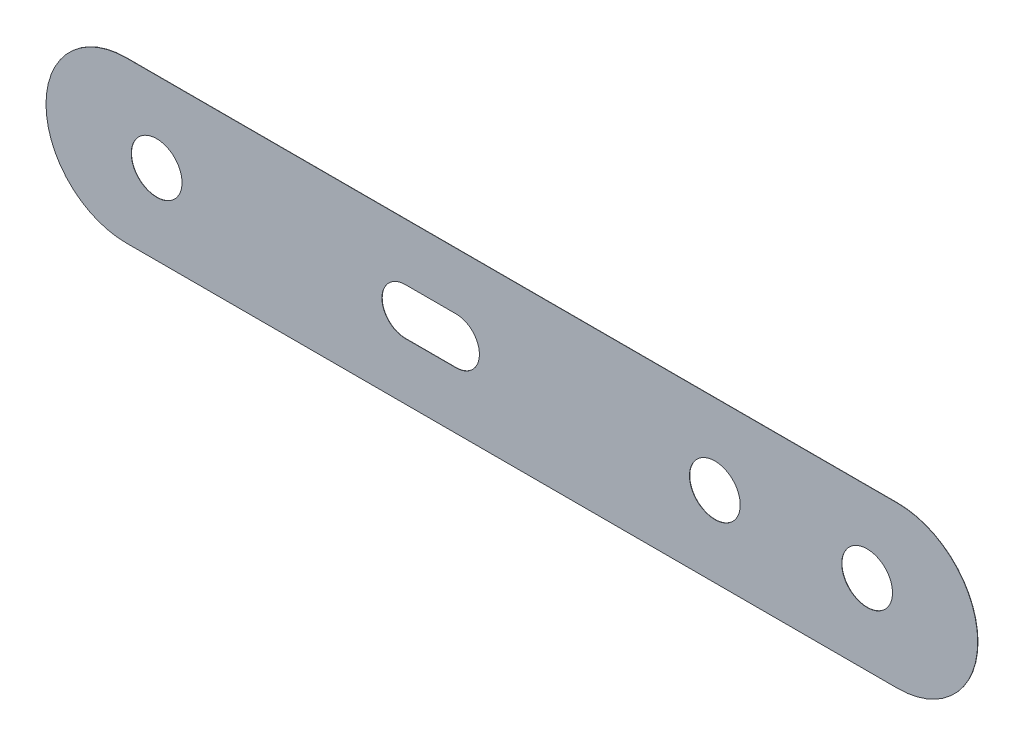
ISO-10303-21;
HEADER;
FILE_DESCRIPTION(('STEP AP214'),'2;1');
FILE_NAME('part.step','',(''),(''),'','','');
FILE_SCHEMA(('AUTOMOTIVE_DESIGN { 1 0 10303 214 1 1 1 1 }'));
ENDSEC;
DATA;
#1=APPLICATION_CONTEXT('core data for automotive mechanical design processes');
#2=APPLICATION_PROTOCOL_DEFINITION('international standard','automotive_design',2000,#1);
#3=PRODUCT_CONTEXT('',#1,'mechanical');
#4=PRODUCT('Part','Part','',(#3));
#5=PRODUCT_RELATED_PRODUCT_CATEGORY('part','',(#4));
#6=PRODUCT_DEFINITION_FORMATION('','',#4);
#7=PRODUCT_DEFINITION_CONTEXT('part definition',#1,'design');
#8=PRODUCT_DEFINITION('design','',#6,#7);
#9=PRODUCT_DEFINITION_SHAPE('','',#8);
#10=(LENGTH_UNIT() NAMED_UNIT(*) SI_UNIT(.MILLI.,.METRE.));
#11=(NAMED_UNIT(*) PLANE_ANGLE_UNIT() SI_UNIT($,.RADIAN.));
#12=(NAMED_UNIT(*) SI_UNIT($,.STERADIAN.) SOLID_ANGLE_UNIT());
#13=UNCERTAINTY_MEASURE_WITH_UNIT(LENGTH_MEASURE(1.E-05),#10,'distance_accuracy_value','');
#14=(GEOMETRIC_REPRESENTATION_CONTEXT(3) GLOBAL_UNCERTAINTY_ASSIGNED_CONTEXT((#13)) GLOBAL_UNIT_ASSIGNED_CONTEXT((#10,
#11,#12)) REPRESENTATION_CONTEXT('',''));
#15=CARTESIAN_POINT('',(0.,0.,0.));
#16=DIRECTION('',(0.,0.,1.));
#17=DIRECTION('',(1.,0.,0.));
#18=AXIS2_PLACEMENT_3D('',#15,#16,#17);
#19=CARTESIAN_POINT('',(-10.5,0.,-0.65));
#20=DIRECTION('',(0.,0.,1.));
#21=DIRECTION('',(1.,0.,0.));
#22=AXIS2_PLACEMENT_3D('',#19,#20,#21);
#23=CYLINDRICAL_SURFACE('',#22,2.3);
#24=DIRECTION('',(0.,0.,-1.));
#25=VECTOR('',#24,1.);
#26=CARTESIAN_POINT('',(-10.5,-2.3,-0.65));
#27=LINE('',#26,#25);
#28=CARTESIAN_POINT('',(-10.5,-2.3,-0.65));
#29=VERTEX_POINT('',#28);
#30=CARTESIAN_POINT('',(-10.5,-2.3,-0.675));
#31=VERTEX_POINT('',#30);
#32=EDGE_CURVE('E11',#29,#31,#27,.T.);
#33=ORIENTED_EDGE('',*,*,#32,.T.);
#34=CARTESIAN_POINT('',(-10.5,0.,-0.675));
#35=DIRECTION('',(0.,0.,1.));
#36=DIRECTION('',(0.,1.,0.));
#37=AXIS2_PLACEMENT_3D('',#34,#35,#36);
#38=CIRCLE('',#37,2.3);
#39=CARTESIAN_POINT('',(-10.5,2.3,-0.675));
#40=VERTEX_POINT('',#39);
#41=EDGE_CURVE('E303',#40,#31,#38,.T.);
#42=ORIENTED_EDGE('',*,*,#41,.F.);
#43=DIRECTION('',(0.,0.,-1.));
#44=VECTOR('',#43,1.);
#45=CARTESIAN_POINT('',(-10.5,2.3,-0.65));
#46=LINE('',#45,#44);
#47=CARTESIAN_POINT('',(-10.5,2.3,-0.65));
#48=VERTEX_POINT('',#47);
#49=EDGE_CURVE('E202',#48,#40,#46,.T.);
#50=ORIENTED_EDGE('',*,*,#49,.F.);
#51=CARTESIAN_POINT('',(-10.5,0.,-0.65));
#52=DIRECTION('',(0.,0.,1.));
#53=DIRECTION('',(0.,1.,0.));
#54=AXIS2_PLACEMENT_3D('',#51,#52,#53);
#55=CIRCLE('',#54,2.3);
#56=EDGE_CURVE('E184',#48,#29,#55,.T.);
#57=ORIENTED_EDGE('',*,*,#56,.T.);
#58=EDGE_LOOP('',(#33,#42,#50,#57));
#59=FACE_BOUND('',#58,.T.);
#60=ADVANCED_FACE('F16',(#59),#23,.F.);
#61=CARTESIAN_POINT('',(-10.5,-2.3,-0.65));
#62=DIRECTION('',(0.,-1.,0.));
#63=DIRECTION('',(0.,0.,-1.));
#64=AXIS2_PLACEMENT_3D('',#61,#62,#63);
#65=PLANE('',#64);
#66=DIRECTION('',(0.,0.,-1.));
#67=VECTOR('',#66,1.);
#68=CARTESIAN_POINT('',(-5.5,-2.3,-0.65));
#69=LINE('',#68,#67);
#70=CARTESIAN_POINT('',(-5.5,-2.3,-0.65));
#71=VERTEX_POINT('',#70);
#72=CARTESIAN_POINT('',(-5.5,-2.3,-0.675));
#73=VERTEX_POINT('',#72);
#74=EDGE_CURVE('E27',#71,#73,#69,.T.);
#75=ORIENTED_EDGE('',*,*,#74,.T.);
#76=DIRECTION('',(1.,0.,0.));
#77=VECTOR('',#76,1.);
#78=CARTESIAN_POINT('',(-10.5,-2.3,-0.675));
#79=LINE('',#78,#77);
#80=EDGE_CURVE('E300',#31,#73,#79,.T.);
#81=ORIENTED_EDGE('',*,*,#80,.F.);
#82=ORIENTED_EDGE('',*,*,#32,.F.);
#83=DIRECTION('',(1.,0.,0.));
#84=VECTOR('',#83,1.);
#85=CARTESIAN_POINT('',(-10.5,-2.3,-0.65));
#86=LINE('',#85,#84);
#87=EDGE_CURVE('E159',#29,#71,#86,.T.);
#88=ORIENTED_EDGE('',*,*,#87,.T.);
#89=EDGE_LOOP('',(#75,#81,#82,#88));
#90=FACE_BOUND('',#89,.T.);
#91=ADVANCED_FACE('F242',(#90),#65,.F.);
#92=CARTESIAN_POINT('',(-5.5,0.,-0.65));
#93=DIRECTION('',(0.,0.,1.));
#94=DIRECTION('',(1.,0.,0.));
#95=AXIS2_PLACEMENT_3D('',#92,#93,#94);
#96=CYLINDRICAL_SURFACE('',#95,2.3);
#97=DIRECTION('',(0.,0.,-1.));
#98=VECTOR('',#97,1.);
#99=CARTESIAN_POINT('',(-5.5,2.3,-0.65));
#100=LINE('',#99,#98);
#101=CARTESIAN_POINT('',(-5.5,2.3,-0.65));
#102=VERTEX_POINT('',#101);
#103=CARTESIAN_POINT('',(-5.5,2.3,-0.675));
#104=VERTEX_POINT('',#103);
#105=EDGE_CURVE('E41',#102,#104,#100,.T.);
#106=ORIENTED_EDGE('',*,*,#105,.T.);
#107=CARTESIAN_POINT('',(-5.5,0.,-0.675));
#108=DIRECTION('',(0.,0.,1.));
#109=DIRECTION('',(0.,-1.,0.));
#110=AXIS2_PLACEMENT_3D('',#107,#108,#109);
#111=CIRCLE('',#110,2.3);
#112=EDGE_CURVE('E222',#73,#104,#111,.T.);
#113=ORIENTED_EDGE('',*,*,#112,.F.);
#114=ORIENTED_EDGE('',*,*,#74,.F.);
#115=CARTESIAN_POINT('',(-5.5,0.,-0.65));
#116=DIRECTION('',(0.,0.,1.));
#117=DIRECTION('',(0.,-1.,0.));
#118=AXIS2_PLACEMENT_3D('',#115,#116,#117);
#119=CIRCLE('',#118,2.3);
#120=EDGE_CURVE('E156',#71,#102,#119,.T.);
#121=ORIENTED_EDGE('',*,*,#120,.T.);
#122=EDGE_LOOP('',(#106,#113,#114,#121));
#123=FACE_BOUND('',#122,.T.);
#124=ADVANCED_FACE('F381',(#123),#96,.F.);
#125=CARTESIAN_POINT('',(-5.5,2.3,-0.65));
#126=DIRECTION('',(0.,1.,0.));
#127=DIRECTION('',(1.,0.,0.));
#128=AXIS2_PLACEMENT_3D('',#125,#126,#127);
#129=PLANE('',#128);
#130=ORIENTED_EDGE('',*,*,#49,.T.);
#131=DIRECTION('',(-1.,0.,0.));
#132=VECTOR('',#131,1.);
#133=CARTESIAN_POINT('',(-5.5,2.3,-0.675));
#134=LINE('',#133,#132);
#135=EDGE_CURVE('E198',#104,#40,#134,.T.);
#136=ORIENTED_EDGE('',*,*,#135,.F.);
#137=ORIENTED_EDGE('',*,*,#105,.F.);
#138=DIRECTION('',(-1.,0.,0.));
#139=VECTOR('',#138,1.);
#140=CARTESIAN_POINT('',(-5.5,2.3,-0.65));
#141=LINE('',#140,#139);
#142=EDGE_CURVE('E210',#102,#48,#141,.T.);
#143=ORIENTED_EDGE('',*,*,#142,.T.);
#144=EDGE_LOOP('',(#130,#136,#137,#143));
#145=FACE_BOUND('',#144,.T.);
#146=ADVANCED_FACE('F373',(#145),#129,.F.);
#147=CARTESIAN_POINT('',(35.,0.,-0.65));
#148=DIRECTION('',(0.,0.,1.));
#149=DIRECTION('',(1.,0.,0.));
#150=AXIS2_PLACEMENT_3D('',#147,#148,#149);
#151=CYLINDRICAL_SURFACE('',#150,2.5);
#152=DIRECTION('',(0.,0.,1.));
#153=VECTOR('',#152,1.);
#154=CARTESIAN_POINT('',(37.5,0.,-0.675));
#155=LINE('',#154,#153);
#156=CARTESIAN_POINT('',(37.5,0.,-0.675));
#157=VERTEX_POINT('',#156);
#158=CARTESIAN_POINT('',(37.5,0.,-0.65));
#159=VERTEX_POINT('',#158);
#160=EDGE_CURVE('E201',#157,#159,#155,.T.);
#161=ORIENTED_EDGE('',*,*,#160,.F.);
#162=CARTESIAN_POINT('',(35.,0.,-0.675));
#163=DIRECTION('',(0.,0.,1.));
#164=DIRECTION('',(-1.,0.,0.));
#165=AXIS2_PLACEMENT_3D('',#162,#163,#164);
#166=CIRCLE('',#165,2.5);
#167=CARTESIAN_POINT('',(32.5,0.,-0.675));
#168=VERTEX_POINT('',#167);
#169=EDGE_CURVE('E318',#168,#157,#166,.T.);
#170=ORIENTED_EDGE('',*,*,#169,.F.);
#171=DIRECTION('',(0.,0.,1.));
#172=VECTOR('',#171,1.);
#173=CARTESIAN_POINT('',(32.5,0.,-0.675));
#174=LINE('',#173,#172);
#175=CARTESIAN_POINT('',(32.5,0.,-0.65));
#176=VERTEX_POINT('',#175);
#177=EDGE_CURVE('E175',#168,#176,#174,.T.);
#178=ORIENTED_EDGE('',*,*,#177,.T.);
#179=CARTESIAN_POINT('',(35.,0.,-0.65));
#180=DIRECTION('',(0.,0.,1.));
#181=DIRECTION('',(-1.,0.,0.));
#182=AXIS2_PLACEMENT_3D('',#179,#180,#181);
#183=CIRCLE('',#182,2.5);
#184=EDGE_CURVE('E167',#176,#159,#183,.T.);
#185=ORIENTED_EDGE('',*,*,#184,.T.);
#186=EDGE_LOOP('',(#161,#170,#178,#185));
#187=FACE_BOUND('',#186,.T.);
#188=ADVANCED_FACE('F361',(#187),#151,.F.);
#189=CARTESIAN_POINT('',(35.,0.,-0.65));
#190=DIRECTION('',(0.,0.,1.));
#191=DIRECTION('',(1.,0.,0.));
#192=AXIS2_PLACEMENT_3D('',#189,#190,#191);
#193=CYLINDRICAL_SURFACE('',#192,2.5);
#194=ORIENTED_EDGE('',*,*,#177,.F.);
#195=CARTESIAN_POINT('',(35.,0.,-0.675));
#196=DIRECTION('',(0.,0.,1.));
#197=DIRECTION('',(1.,0.,0.));
#198=AXIS2_PLACEMENT_3D('',#195,#196,#197);
#199=CIRCLE('',#198,2.5);
#200=EDGE_CURVE('E307',#157,#168,#199,.T.);
#201=ORIENTED_EDGE('',*,*,#200,.F.);
#202=ORIENTED_EDGE('',*,*,#160,.T.);
#203=CARTESIAN_POINT('',(35.,0.,-0.65));
#204=DIRECTION('',(0.,0.,1.));
#205=DIRECTION('',(1.,0.,0.));
#206=AXIS2_PLACEMENT_3D('',#203,#204,#205);
#207=CIRCLE('',#206,2.5);
#208=EDGE_CURVE('E160',#159,#176,#207,.T.);
#209=ORIENTED_EDGE('',*,*,#208,.T.);
#210=EDGE_LOOP('',(#194,#201,#202,#209));
#211=FACE_BOUND('',#210,.T.);
#212=ADVANCED_FACE('F364',(#211),#193,.F.);
#213=CARTESIAN_POINT('',(20.,0.,-0.65));
#214=DIRECTION('',(0.,0.,1.));
#215=DIRECTION('',(1.,0.,0.));
#216=AXIS2_PLACEMENT_3D('',#213,#214,#215);
#217=CYLINDRICAL_SURFACE('',#216,2.5);
#218=DIRECTION('',(0.,0.,1.));
#219=VECTOR('',#218,1.);
#220=CARTESIAN_POINT('',(22.5,0.,-0.675));
#221=LINE('',#220,#219);
#222=CARTESIAN_POINT('',(22.5,0.,-0.675));
#223=VERTEX_POINT('',#222);
#224=CARTESIAN_POINT('',(22.5,0.,-0.65));
#225=VERTEX_POINT('',#224);
#226=EDGE_CURVE('E171',#223,#225,#221,.T.);
#227=ORIENTED_EDGE('',*,*,#226,.F.);
#228=CARTESIAN_POINT('',(20.,0.,-0.675));
#229=DIRECTION('',(0.,0.,1.));
#230=DIRECTION('',(-1.,0.,0.));
#231=AXIS2_PLACEMENT_3D('',#228,#229,#230);
#232=CIRCLE('',#231,2.5);
#233=CARTESIAN_POINT('',(17.5,0.,-0.675));
#234=VERTEX_POINT('',#233);
#235=EDGE_CURVE('E20',#234,#223,#232,.T.);
#236=ORIENTED_EDGE('',*,*,#235,.F.);
#237=DIRECTION('',(0.,0.,1.));
#238=VECTOR('',#237,1.);
#239=CARTESIAN_POINT('',(17.5,0.,-0.675));
#240=LINE('',#239,#238);
#241=CARTESIAN_POINT('',(17.5,0.,-0.65));
#242=VERTEX_POINT('',#241);
#243=EDGE_CURVE('E176',#234,#242,#240,.T.);
#244=ORIENTED_EDGE('',*,*,#243,.T.);
#245=CARTESIAN_POINT('',(20.,0.,-0.65));
#246=DIRECTION('',(0.,0.,1.));
#247=DIRECTION('',(-1.,0.,0.));
#248=AXIS2_PLACEMENT_3D('',#245,#246,#247);
#249=CIRCLE('',#248,2.5);
#250=EDGE_CURVE('E150',#242,#225,#249,.T.);
#251=ORIENTED_EDGE('',*,*,#250,.T.);
#252=EDGE_LOOP('',(#227,#236,#244,#251));
#253=FACE_BOUND('',#252,.T.);
#254=ADVANCED_FACE('F290',(#253),#217,.F.);
#255=CARTESIAN_POINT('',(20.,0.,-0.65));
#256=DIRECTION('',(0.,0.,1.));
#257=DIRECTION('',(1.,0.,0.));
#258=AXIS2_PLACEMENT_3D('',#255,#256,#257);
#259=CYLINDRICAL_SURFACE('',#258,2.5);
#260=ORIENTED_EDGE('',*,*,#243,.F.);
#261=CARTESIAN_POINT('',(20.,0.,-0.675));
#262=DIRECTION('',(0.,0.,1.));
#263=DIRECTION('',(1.,0.,0.));
#264=AXIS2_PLACEMENT_3D('',#261,#262,#263);
#265=CIRCLE('',#264,2.5);
#266=EDGE_CURVE('E286',#223,#234,#265,.T.);
#267=ORIENTED_EDGE('',*,*,#266,.F.);
#268=ORIENTED_EDGE('',*,*,#226,.T.);
#269=CARTESIAN_POINT('',(20.,0.,-0.65));
#270=DIRECTION('',(0.,0.,1.));
#271=DIRECTION('',(1.,0.,0.));
#272=AXIS2_PLACEMENT_3D('',#269,#270,#271);
#273=CIRCLE('',#272,2.5);
#274=EDGE_CURVE('E154',#225,#242,#273,.T.);
#275=ORIENTED_EDGE('',*,*,#274,.T.);
#276=EDGE_LOOP('',(#260,#267,#268,#275));
#277=FACE_BOUND('',#276,.T.);
#278=ADVANCED_FACE('F283',(#277),#259,.F.);
#279=CARTESIAN_POINT('',(-35.,0.,-0.65));
#280=DIRECTION('',(0.,0.,1.));
#281=DIRECTION('',(1.,0.,0.));
#282=AXIS2_PLACEMENT_3D('',#279,#280,#281);
#283=CYLINDRICAL_SURFACE('',#282,2.5);
#284=DIRECTION('',(0.,0.,1.));
#285=VECTOR('',#284,1.);
#286=CARTESIAN_POINT('',(-32.5,0.,-0.675));
#287=LINE('',#286,#285);
#288=CARTESIAN_POINT('',(-32.5,0.,-0.675));
#289=VERTEX_POINT('',#288);
#290=CARTESIAN_POINT('',(-32.5,0.,-0.65));
#291=VERTEX_POINT('',#290);
#292=EDGE_CURVE('E197',#289,#291,#287,.T.);
#293=ORIENTED_EDGE('',*,*,#292,.F.);
#294=CARTESIAN_POINT('',(-35.,0.,-0.675));
#295=DIRECTION('',(0.,0.,1.));
#296=DIRECTION('',(-1.,0.,0.));
#297=AXIS2_PLACEMENT_3D('',#294,#295,#296);
#298=CIRCLE('',#297,2.5);
#299=CARTESIAN_POINT('',(-37.5,0.,-0.675));
#300=VERTEX_POINT('',#299);
#301=EDGE_CURVE('E192',#300,#289,#298,.T.);
#302=ORIENTED_EDGE('',*,*,#301,.F.);
#303=DIRECTION('',(0.,0.,1.));
#304=VECTOR('',#303,1.);
#305=CARTESIAN_POINT('',(-37.5,0.,-0.675));
#306=LINE('',#305,#304);
#307=CARTESIAN_POINT('',(-37.5,0.,-0.65));
#308=VERTEX_POINT('',#307);
#309=EDGE_CURVE('E193',#300,#308,#306,.T.);
#310=ORIENTED_EDGE('',*,*,#309,.T.);
#311=CARTESIAN_POINT('',(-35.,0.,-0.65));
#312=DIRECTION('',(0.,0.,1.));
#313=DIRECTION('',(-1.,0.,0.));
#314=AXIS2_PLACEMENT_3D('',#311,#312,#313);
#315=CIRCLE('',#314,2.5);
#316=EDGE_CURVE('E180',#308,#291,#315,.T.);
#317=ORIENTED_EDGE('',*,*,#316,.T.);
#318=EDGE_LOOP('',(#293,#302,#310,#317));
#319=FACE_BOUND('',#318,.T.);
#320=ADVANCED_FACE('F335',(#319),#283,.F.);
#321=CARTESIAN_POINT('',(-35.,0.,-0.65));
#322=DIRECTION('',(0.,0.,1.));
#323=DIRECTION('',(1.,0.,0.));
#324=AXIS2_PLACEMENT_3D('',#321,#322,#323);
#325=CYLINDRICAL_SURFACE('',#324,2.5);
#326=ORIENTED_EDGE('',*,*,#309,.F.);
#327=CARTESIAN_POINT('',(-35.,0.,-0.675));
#328=DIRECTION('',(0.,0.,1.));
#329=DIRECTION('',(1.,0.,0.));
#330=AXIS2_PLACEMENT_3D('',#327,#328,#329);
#331=CIRCLE('',#330,2.5);
#332=EDGE_CURVE('E188',#289,#300,#331,.T.);
#333=ORIENTED_EDGE('',*,*,#332,.F.);
#334=ORIENTED_EDGE('',*,*,#292,.T.);
#335=CARTESIAN_POINT('',(-35.,0.,-0.65));
#336=DIRECTION('',(0.,0.,1.));
#337=DIRECTION('',(1.,0.,0.));
#338=AXIS2_PLACEMENT_3D('',#335,#336,#337);
#339=CIRCLE('',#338,2.5);
#340=EDGE_CURVE('E155',#291,#308,#339,.T.);
#341=ORIENTED_EDGE('',*,*,#340,.T.);
#342=EDGE_LOOP('',(#326,#333,#334,#341));
#343=FACE_BOUND('',#342,.T.);
#344=ADVANCED_FACE('F329',(#343),#325,.F.);
#345=CARTESIAN_POINT('',(0.,0.,-0.675));
#346=DIRECTION('',(0.,0.,1.));
#347=DIRECTION('',(1.,0.,0.));
#348=AXIS2_PLACEMENT_3D('',#345,#346,#347);
#349=PLANE('',#348);
#350=ORIENTED_EDGE('',*,*,#41,.T.);
#351=ORIENTED_EDGE('',*,*,#80,.T.);
#352=ORIENTED_EDGE('',*,*,#112,.T.);
#353=ORIENTED_EDGE('',*,*,#135,.T.);
#354=EDGE_LOOP('',(#350,#351,#352,#353));
#355=FACE_BOUND('',#354,.T.);
#356=ORIENTED_EDGE('',*,*,#169,.T.);
#357=ORIENTED_EDGE('',*,*,#200,.T.);
#358=EDGE_LOOP('',(#356,#357));
#359=FACE_BOUND('',#358,.T.);
#360=ORIENTED_EDGE('',*,*,#235,.T.);
#361=ORIENTED_EDGE('',*,*,#266,.T.);
#362=EDGE_LOOP('',(#360,#361));
#363=FACE_BOUND('',#362,.T.);
#364=ORIENTED_EDGE('',*,*,#301,.T.);
#365=ORIENTED_EDGE('',*,*,#332,.T.);
#366=EDGE_LOOP('',(#364,#365));
#367=FACE_BOUND('',#366,.T.);
#368=DIRECTION('',(-1.,0.,0.));
#369=VECTOR('',#368,1.);
#370=CARTESIAN_POINT('',(38.,-7.9,-0.675));
#371=LINE('',#370,#369);
#372=CARTESIAN_POINT('',(38.,-7.9,-0.675));
#373=VERTEX_POINT('',#372);
#374=CARTESIAN_POINT('',(-38.,-7.9,-0.675));
#375=VERTEX_POINT('',#374);
#376=EDGE_CURVE('E118',#373,#375,#371,.T.);
#377=ORIENTED_EDGE('',*,*,#376,.T.);
#378=CARTESIAN_POINT('',(-38.,0.,-0.675));
#379=DIRECTION('',(0.,0.,-1.));
#380=DIRECTION('',(0.,-1.,0.));
#381=AXIS2_PLACEMENT_3D('',#378,#379,#380);
#382=CIRCLE('',#381,7.9);
#383=CARTESIAN_POINT('',(-38.,7.9,-0.675));
#384=VERTEX_POINT('',#383);
#385=EDGE_CURVE('E111',#375,#384,#382,.T.);
#386=ORIENTED_EDGE('',*,*,#385,.T.);
#387=DIRECTION('',(1.,0.,0.));
#388=VECTOR('',#387,1.);
#389=CARTESIAN_POINT('',(-38.,7.9,-0.675));
#390=LINE('',#389,#388);
#391=CARTESIAN_POINT('',(38.,7.9,-0.675));
#392=VERTEX_POINT('',#391);
#393=EDGE_CURVE('E116',#384,#392,#390,.T.);
#394=ORIENTED_EDGE('',*,*,#393,.T.);
#395=CARTESIAN_POINT('',(38.,0.,-0.675));
#396=DIRECTION('',(0.,0.,-1.));
#397=DIRECTION('',(0.,1.,0.));
#398=AXIS2_PLACEMENT_3D('',#395,#396,#397);
#399=CIRCLE('',#398,7.9);
#400=EDGE_CURVE('E143',#392,#373,#399,.T.);
#401=ORIENTED_EDGE('',*,*,#400,.T.);
#402=EDGE_LOOP('',(#377,#386,#394,#401));
#403=FACE_BOUND('',#402,.T.);
#404=ADVANCED_FACE('F113',(#355,#359,#363,#367,#403),#349,.F.);
#405=CARTESIAN_POINT('',(-38.,-7.9,-0.65));
#406=DIRECTION('',(0.,-1.,0.));
#407=DIRECTION('',(0.,0.,-1.));
#408=AXIS2_PLACEMENT_3D('',#405,#406,#407);
#409=PLANE('',#408);
#410=DIRECTION('',(0.,0.,1.));
#411=VECTOR('',#410,1.);
#412=CARTESIAN_POINT('',(-38.,-7.9,-0.675));
#413=LINE('',#412,#411);
#414=CARTESIAN_POINT('',(-38.,-7.9,-0.65));
#415=VERTEX_POINT('',#414);
#416=EDGE_CURVE('E123',#375,#415,#413,.T.);
#417=ORIENTED_EDGE('',*,*,#416,.F.);
#418=ORIENTED_EDGE('',*,*,#376,.F.);
#419=DIRECTION('',(0.,0.,1.));
#420=VECTOR('',#419,1.);
#421=CARTESIAN_POINT('',(38.,-7.9,-0.675));
#422=LINE('',#421,#420);
#423=CARTESIAN_POINT('',(38.,-7.9,-0.65));
#424=VERTEX_POINT('',#423);
#425=EDGE_CURVE('E214',#373,#424,#422,.T.);
#426=ORIENTED_EDGE('',*,*,#425,.T.);
#427=DIRECTION('',(-1.,0.,0.));
#428=VECTOR('',#427,1.);
#429=CARTESIAN_POINT('',(38.,-7.9,-0.65));
#430=LINE('',#429,#428);
#431=EDGE_CURVE('E148',#424,#415,#430,.T.);
#432=ORIENTED_EDGE('',*,*,#431,.T.);
#433=EDGE_LOOP('',(#417,#418,#426,#432));
#434=FACE_BOUND('',#433,.T.);
#435=ADVANCED_FACE('F328',(#434),#409,.T.);
#436=CARTESIAN_POINT('',(-38.,0.,-0.65));
#437=DIRECTION('',(0.,0.,1.));
#438=DIRECTION('',(1.,0.,0.));
#439=AXIS2_PLACEMENT_3D('',#436,#437,#438);
#440=CYLINDRICAL_SURFACE('',#439,7.9);
#441=DIRECTION('',(0.,0.,1.));
#442=VECTOR('',#441,1.);
#443=CARTESIAN_POINT('',(-38.,7.9,-0.675));
#444=LINE('',#443,#442);
#445=CARTESIAN_POINT('',(-38.,7.9,-0.65));
#446=VERTEX_POINT('',#445);
#447=EDGE_CURVE('E124',#384,#446,#444,.T.);
#448=ORIENTED_EDGE('',*,*,#447,.F.);
#449=ORIENTED_EDGE('',*,*,#385,.F.);
#450=ORIENTED_EDGE('',*,*,#416,.T.);
#451=CARTESIAN_POINT('',(-38.,0.,-0.65));
#452=DIRECTION('',(0.,0.,-1.));
#453=DIRECTION('',(0.,-1.,0.));
#454=AXIS2_PLACEMENT_3D('',#451,#452,#453);
#455=CIRCLE('',#454,7.9);
#456=EDGE_CURVE('E130',#415,#446,#455,.T.);
#457=ORIENTED_EDGE('',*,*,#456,.T.);
#458=EDGE_LOOP('',(#448,#449,#450,#457));
#459=FACE_BOUND('',#458,.T.);
#460=ADVANCED_FACE('F128',(#459),#440,.T.);
#461=CARTESIAN_POINT('',(38.,7.9,-0.65));
#462=DIRECTION('',(0.,1.,0.));
#463=DIRECTION('',(1.,0.,0.));
#464=AXIS2_PLACEMENT_3D('',#461,#462,#463);
#465=PLANE('',#464);
#466=DIRECTION('',(0.,0.,1.));
#467=VECTOR('',#466,1.);
#468=CARTESIAN_POINT('',(38.,7.9,-0.675));
#469=LINE('',#468,#467);
#470=CARTESIAN_POINT('',(38.,7.9,-0.65));
#471=VERTEX_POINT('',#470);
#472=EDGE_CURVE('E136',#392,#471,#469,.T.);
#473=ORIENTED_EDGE('',*,*,#472,.F.);
#474=ORIENTED_EDGE('',*,*,#393,.F.);
#475=ORIENTED_EDGE('',*,*,#447,.T.);
#476=DIRECTION('',(1.,0.,0.));
#477=VECTOR('',#476,1.);
#478=CARTESIAN_POINT('',(-38.,7.9,-0.65));
#479=LINE('',#478,#477);
#480=EDGE_CURVE('E149',#446,#471,#479,.T.);
#481=ORIENTED_EDGE('',*,*,#480,.T.);
#482=EDGE_LOOP('',(#473,#474,#475,#481));
#483=FACE_BOUND('',#482,.T.);
#484=ADVANCED_FACE('F18',(#483),#465,.T.);
#485=CARTESIAN_POINT('',(38.,0.,-0.65));
#486=DIRECTION('',(0.,0.,1.));
#487=DIRECTION('',(1.,0.,0.));
#488=AXIS2_PLACEMENT_3D('',#485,#486,#487);
#489=CYLINDRICAL_SURFACE('',#488,7.9);
#490=ORIENTED_EDGE('',*,*,#425,.F.);
#491=ORIENTED_EDGE('',*,*,#400,.F.);
#492=ORIENTED_EDGE('',*,*,#472,.T.);
#493=CARTESIAN_POINT('',(38.,0.,-0.65));
#494=DIRECTION('',(0.,0.,-1.));
#495=DIRECTION('',(0.,1.,0.));
#496=AXIS2_PLACEMENT_3D('',#493,#494,#495);
#497=CIRCLE('',#496,7.9);
#498=EDGE_CURVE('E166',#471,#424,#497,.T.);
#499=ORIENTED_EDGE('',*,*,#498,.T.);
#500=EDGE_LOOP('',(#490,#491,#492,#499));
#501=FACE_BOUND('',#500,.T.);
#502=ADVANCED_FACE('F344',(#501),#489,.T.);
#503=CARTESIAN_POINT('',(0.,0.,-0.65));
#504=DIRECTION('',(0.,0.,1.));
#505=DIRECTION('',(1.,0.,0.));
#506=AXIS2_PLACEMENT_3D('',#503,#504,#505);
#507=PLANE('',#506);
#508=ORIENTED_EDGE('',*,*,#120,.F.);
#509=ORIENTED_EDGE('',*,*,#87,.F.);
#510=ORIENTED_EDGE('',*,*,#56,.F.);
#511=ORIENTED_EDGE('',*,*,#142,.F.);
#512=EDGE_LOOP('',(#508,#509,#510,#511));
#513=FACE_BOUND('',#512,.T.);
#514=ORIENTED_EDGE('',*,*,#184,.F.);
#515=ORIENTED_EDGE('',*,*,#208,.F.);
#516=EDGE_LOOP('',(#514,#515));
#517=FACE_BOUND('',#516,.T.);
#518=ORIENTED_EDGE('',*,*,#250,.F.);
#519=ORIENTED_EDGE('',*,*,#274,.F.);
#520=EDGE_LOOP('',(#518,#519));
#521=FACE_BOUND('',#520,.T.);
#522=ORIENTED_EDGE('',*,*,#316,.F.);
#523=ORIENTED_EDGE('',*,*,#340,.F.);
#524=EDGE_LOOP('',(#522,#523));
#525=FACE_BOUND('',#524,.T.);
#526=ORIENTED_EDGE('',*,*,#480,.F.);
#527=ORIENTED_EDGE('',*,*,#456,.F.);
#528=ORIENTED_EDGE('',*,*,#431,.F.);
#529=ORIENTED_EDGE('',*,*,#498,.F.);
#530=EDGE_LOOP('',(#526,#527,#528,#529));
#531=FACE_BOUND('',#530,.T.);
#532=ADVANCED_FACE('F239',(#513,#517,#521,#525,#531),#507,.T.);
#533=CLOSED_SHELL('',(#60,#91,#124,#146,#188,#212,#254,#278,#320,#344,#404,#435,#460,#484,#502,#532));
#534=MANIFOLD_SOLID_BREP('B1',#533);
#535=ADVANCED_BREP_SHAPE_REPRESENTATION('',(#18,#534),#14);
#536=SHAPE_DEFINITION_REPRESENTATION(#9,#535);
ENDSEC;
END-ISO-10303-21;
